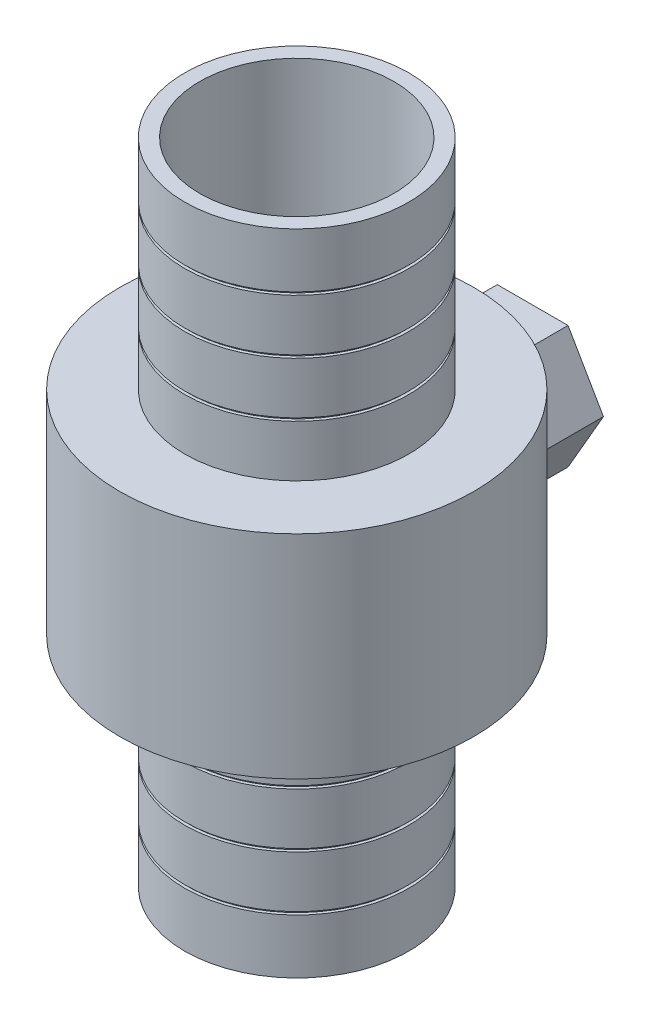
ISO-10303-21;
HEADER;
FILE_DESCRIPTION(('STEP AP214'),'2;1');
FILE_NAME('part.step','',(''),(''),'','','');
FILE_SCHEMA(('AUTOMOTIVE_DESIGN { 1 0 10303 214 1 1 1 1 }'));
ENDSEC;
DATA;
#1=APPLICATION_CONTEXT('core data for automotive mechanical design processes');
#2=APPLICATION_PROTOCOL_DEFINITION('international standard','automotive_design',2000,#1);
#3=PRODUCT_CONTEXT('',#1,'mechanical');
#4=PRODUCT('Part','Part','',(#3));
#5=PRODUCT_RELATED_PRODUCT_CATEGORY('part','',(#4));
#6=PRODUCT_DEFINITION_FORMATION('','',#4);
#7=PRODUCT_DEFINITION_CONTEXT('part definition',#1,'design');
#8=PRODUCT_DEFINITION('design','',#6,#7);
#9=PRODUCT_DEFINITION_SHAPE('','',#8);
#10=(LENGTH_UNIT() NAMED_UNIT(*) SI_UNIT(.MILLI.,.METRE.));
#11=(NAMED_UNIT(*) PLANE_ANGLE_UNIT() SI_UNIT($,.RADIAN.));
#12=(NAMED_UNIT(*) SI_UNIT($,.STERADIAN.) SOLID_ANGLE_UNIT());
#13=UNCERTAINTY_MEASURE_WITH_UNIT(LENGTH_MEASURE(1.E-05),#10,'distance_accuracy_value','');
#14=(GEOMETRIC_REPRESENTATION_CONTEXT(3) GLOBAL_UNCERTAINTY_ASSIGNED_CONTEXT((#13)) GLOBAL_UNIT_ASSIGNED_CONTEXT((#10,
#11,#12)) REPRESENTATION_CONTEXT('',''));
#15=CARTESIAN_POINT('',(0.,0.,0.));
#16=DIRECTION('',(0.,0.,1.));
#17=DIRECTION('',(1.,0.,0.));
#18=AXIS2_PLACEMENT_3D('',#15,#16,#17);
#19=CARTESIAN_POINT('',(6.,27.5,-20.));
#20=DIRECTION('',(-0.866025403784439,0.5,0.));
#21=DIRECTION('',(-0.5,-0.866025403784439,0.));
#22=AXIS2_PLACEMENT_3D('',#19,#20,#21);
#23=PLANE('',#22);
#24=DIRECTION('',(-0.5,-0.866025403784439,0.));
#25=VECTOR('',#24,1.);
#26=CARTESIAN_POINT('',(6.,27.5,-15.));
#27=LINE('',#26,#25);
#28=CARTESIAN_POINT('',(6.,27.5,-15.));
#29=VERTEX_POINT('',#28);
#30=CARTESIAN_POINT('',(3.,22.3038475772934,-15.));
#31=VERTEX_POINT('',#30);
#32=EDGE_CURVE('E173',#29,#31,#27,.T.);
#33=ORIENTED_EDGE('',*,*,#32,.T.);
#34=DIRECTION('',(0.,0.,1.));
#35=VECTOR('',#34,1.);
#36=CARTESIAN_POINT('',(3.,22.3038475772934,-20.));
#37=LINE('',#36,#35);
#38=CARTESIAN_POINT('',(3.,22.3038475772934,-20.));
#39=VERTEX_POINT('',#38);
#40=EDGE_CURVE('E13',#39,#31,#37,.T.);
#41=ORIENTED_EDGE('',*,*,#40,.F.);
#42=DIRECTION('',(-0.5,-0.866025403784439,0.));
#43=VECTOR('',#42,1.);
#44=CARTESIAN_POINT('',(6.,27.5,-20.));
#45=LINE('',#44,#43);
#46=CARTESIAN_POINT('',(6.,27.5,-20.));
#47=VERTEX_POINT('',#46);
#48=EDGE_CURVE('E183',#47,#39,#45,.T.);
#49=ORIENTED_EDGE('',*,*,#48,.F.);
#50=DIRECTION('',(0.,0.,1.));
#51=VECTOR('',#50,1.);
#52=CARTESIAN_POINT('',(6.,27.5,-20.));
#53=LINE('',#52,#51);
#54=EDGE_CURVE('E169',#47,#29,#53,.T.);
#55=ORIENTED_EDGE('',*,*,#54,.T.);
#56=EDGE_LOOP('',(#33,#41,#49,#55));
#57=FACE_BOUND('',#56,.T.);
#58=ADVANCED_FACE('F89',(#57),#23,.F.);
#59=CARTESIAN_POINT('',(3.,22.3038475772934,-20.));
#60=DIRECTION('',(0.,1.,0.));
#61=DIRECTION('',(0.,0.,1.));
#62=AXIS2_PLACEMENT_3D('',#59,#60,#61);
#63=PLANE('',#62);
#64=DIRECTION('',(-1.,0.,0.));
#65=VECTOR('',#64,1.);
#66=CARTESIAN_POINT('',(3.,22.3038475772934,-15.));
#67=LINE('',#66,#65);
#68=CARTESIAN_POINT('',(-3.,22.3038475772934,-15.));
#69=VERTEX_POINT('',#68);
#70=EDGE_CURVE('E176',#31,#69,#67,.T.);
#71=ORIENTED_EDGE('',*,*,#70,.T.);
#72=DIRECTION('',(0.,0.,1.));
#73=VECTOR('',#72,1.);
#74=CARTESIAN_POINT('',(-3.,22.3038475772934,-20.));
#75=LINE('',#74,#73);
#76=CARTESIAN_POINT('',(-3.,22.3038475772934,-20.));
#77=VERTEX_POINT('',#76);
#78=EDGE_CURVE('E97',#77,#69,#75,.T.);
#79=ORIENTED_EDGE('',*,*,#78,.F.);
#80=DIRECTION('',(-1.,0.,0.));
#81=VECTOR('',#80,1.);
#82=CARTESIAN_POINT('',(3.,22.3038475772934,-20.));
#83=LINE('',#82,#81);
#84=EDGE_CURVE('E142',#39,#77,#83,.T.);
#85=ORIENTED_EDGE('',*,*,#84,.F.);
#86=ORIENTED_EDGE('',*,*,#40,.T.);
#87=EDGE_LOOP('',(#71,#79,#85,#86));
#88=FACE_BOUND('',#87,.T.);
#89=ADVANCED_FACE('F207',(#88),#63,.F.);
#90=CARTESIAN_POINT('',(-3.,22.3038475772934,-20.));
#91=DIRECTION('',(0.866025403784439,0.5,0.));
#92=DIRECTION('',(-0.5,0.866025403784439,0.));
#93=AXIS2_PLACEMENT_3D('',#90,#91,#92);
#94=PLANE('',#93);
#95=DIRECTION('',(-0.5,0.866025403784439,0.));
#96=VECTOR('',#95,1.);
#97=CARTESIAN_POINT('',(-3.,22.3038475772934,-15.));
#98=LINE('',#97,#96);
#99=CARTESIAN_POINT('',(-6.,27.5,-15.));
#100=VERTEX_POINT('',#99);
#101=EDGE_CURVE('E178',#69,#100,#98,.T.);
#102=ORIENTED_EDGE('',*,*,#101,.T.);
#103=DIRECTION('',(0.,0.,1.));
#104=VECTOR('',#103,1.);
#105=CARTESIAN_POINT('',(-6.,27.5,-20.));
#106=LINE('',#105,#104);
#107=CARTESIAN_POINT('',(-6.,27.5,-20.));
#108=VERTEX_POINT('',#107);
#109=EDGE_CURVE('E164',#108,#100,#106,.T.);
#110=ORIENTED_EDGE('',*,*,#109,.F.);
#111=DIRECTION('',(-0.5,0.866025403784439,0.));
#112=VECTOR('',#111,1.);
#113=CARTESIAN_POINT('',(-3.,22.3038475772934,-20.));
#114=LINE('',#113,#112);
#115=EDGE_CURVE('E155',#77,#108,#114,.T.);
#116=ORIENTED_EDGE('',*,*,#115,.F.);
#117=ORIENTED_EDGE('',*,*,#78,.T.);
#118=EDGE_LOOP('',(#102,#110,#116,#117));
#119=FACE_BOUND('',#118,.T.);
#120=ADVANCED_FACE('F189',(#119),#94,.F.);
#121=CARTESIAN_POINT('',(-6.,27.5,-20.));
#122=DIRECTION('',(0.866025403784439,-0.5,0.));
#123=DIRECTION('',(0.5,0.866025403784439,0.));
#124=AXIS2_PLACEMENT_3D('',#121,#122,#123);
#125=PLANE('',#124);
#126=DIRECTION('',(0.5,0.866025403784439,0.));
#127=VECTOR('',#126,1.);
#128=CARTESIAN_POINT('',(-6.,27.5,-15.));
#129=LINE('',#128,#127);
#130=CARTESIAN_POINT('',(-3.00000000000001,32.6961524227066,-15.));
#131=VERTEX_POINT('',#130);
#132=EDGE_CURVE('E163',#100,#131,#129,.T.);
#133=ORIENTED_EDGE('',*,*,#132,.T.);
#134=DIRECTION('',(0.,0.,1.));
#135=VECTOR('',#134,1.);
#136=CARTESIAN_POINT('',(-3.00000000000001,32.6961524227066,-20.));
#137=LINE('',#136,#135);
#138=CARTESIAN_POINT('',(-3.00000000000001,32.6961524227066,-20.));
#139=VERTEX_POINT('',#138);
#140=EDGE_CURVE('E160',#139,#131,#137,.T.);
#141=ORIENTED_EDGE('',*,*,#140,.F.);
#142=DIRECTION('',(0.5,0.866025403784439,0.));
#143=VECTOR('',#142,1.);
#144=CARTESIAN_POINT('',(-6.,27.5,-20.));
#145=LINE('',#144,#143);
#146=EDGE_CURVE('E149',#108,#139,#145,.T.);
#147=ORIENTED_EDGE('',*,*,#146,.F.);
#148=ORIENTED_EDGE('',*,*,#109,.T.);
#149=EDGE_LOOP('',(#133,#141,#147,#148));
#150=FACE_BOUND('',#149,.T.);
#151=ADVANCED_FACE('F161',(#150),#125,.F.);
#152=CARTESIAN_POINT('',(-3.00000000000001,32.6961524227066,-20.));
#153=DIRECTION('',(0.,-1.,0.));
#154=DIRECTION('',(0.,0.,-1.));
#155=AXIS2_PLACEMENT_3D('',#152,#153,#154);
#156=PLANE('',#155);
#157=DIRECTION('',(1.,0.,0.));
#158=VECTOR('',#157,1.);
#159=CARTESIAN_POINT('',(-3.00000000000001,32.6961524227066,-15.));
#160=LINE('',#159,#158);
#161=CARTESIAN_POINT('',(3.,32.6961524227066,-15.));
#162=VERTEX_POINT('',#161);
#163=EDGE_CURVE('E128',#131,#162,#160,.T.);
#164=ORIENTED_EDGE('',*,*,#163,.T.);
#165=DIRECTION('',(0.,0.,1.));
#166=VECTOR('',#165,1.);
#167=CARTESIAN_POINT('',(3.,32.6961524227066,-20.));
#168=LINE('',#167,#166);
#169=CARTESIAN_POINT('',(3.,32.6961524227066,-20.));
#170=VERTEX_POINT('',#169);
#171=EDGE_CURVE('E165',#170,#162,#168,.T.);
#172=ORIENTED_EDGE('',*,*,#171,.F.);
#173=DIRECTION('',(1.,0.,0.));
#174=VECTOR('',#173,1.);
#175=CARTESIAN_POINT('',(-3.00000000000001,32.6961524227066,-20.));
#176=LINE('',#175,#174);
#177=EDGE_CURVE('E153',#139,#170,#176,.T.);
#178=ORIENTED_EDGE('',*,*,#177,.F.);
#179=ORIENTED_EDGE('',*,*,#140,.T.);
#180=EDGE_LOOP('',(#164,#172,#178,#179));
#181=FACE_BOUND('',#180,.T.);
#182=ADVANCED_FACE('F167',(#181),#156,.F.);
#183=CARTESIAN_POINT('',(3.,32.6961524227066,-20.));
#184=DIRECTION('',(-0.866025403784439,-0.5,0.));
#185=DIRECTION('',(0.5,-0.866025403784439,0.));
#186=AXIS2_PLACEMENT_3D('',#183,#184,#185);
#187=PLANE('',#186);
#188=DIRECTION('',(0.5,-0.866025403784439,0.));
#189=VECTOR('',#188,1.);
#190=CARTESIAN_POINT('',(3.,32.6961524227066,-15.));
#191=LINE('',#190,#189);
#192=EDGE_CURVE('E134',#162,#29,#191,.T.);
#193=ORIENTED_EDGE('',*,*,#192,.T.);
#194=ORIENTED_EDGE('',*,*,#54,.F.);
#195=DIRECTION('',(0.5,-0.866025403784439,0.));
#196=VECTOR('',#195,1.);
#197=CARTESIAN_POINT('',(3.,32.6961524227066,-20.));
#198=LINE('',#197,#196);
#199=EDGE_CURVE('E105',#170,#47,#198,.T.);
#200=ORIENTED_EDGE('',*,*,#199,.F.);
#201=ORIENTED_EDGE('',*,*,#171,.T.);
#202=EDGE_LOOP('',(#193,#194,#200,#201));
#203=FACE_BOUND('',#202,.T.);
#204=ADVANCED_FACE('F196',(#203),#187,.F.);
#205=CARTESIAN_POINT('',(0.,0.,-20.));
#206=DIRECTION('',(0.,0.,-1.));
#207=DIRECTION('',(-1.,0.,0.));
#208=AXIS2_PLACEMENT_3D('',#205,#206,#207);
#209=PLANE('',#208);
#210=ORIENTED_EDGE('',*,*,#48,.T.);
#211=ORIENTED_EDGE('',*,*,#84,.T.);
#212=ORIENTED_EDGE('',*,*,#115,.T.);
#213=ORIENTED_EDGE('',*,*,#146,.T.);
#214=ORIENTED_EDGE('',*,*,#177,.T.);
#215=ORIENTED_EDGE('',*,*,#199,.T.);
#216=EDGE_LOOP('',(#210,#211,#212,#213,#214,#215));
#217=FACE_BOUND('',#216,.T.);
#218=ADVANCED_FACE('F151',(#217),#209,.T.);
#219=CARTESIAN_POINT('',(0.,0.,-15.));
#220=DIRECTION('',(0.,0.,-1.));
#221=DIRECTION('',(-1.,0.,0.));
#222=AXIS2_PLACEMENT_3D('',#219,#220,#221);
#223=PLANE('',#222);
#224=ORIENTED_EDGE('',*,*,#32,.F.);
#225=ORIENTED_EDGE('',*,*,#192,.F.);
#226=ORIENTED_EDGE('',*,*,#163,.F.);
#227=ORIENTED_EDGE('',*,*,#132,.F.);
#228=ORIENTED_EDGE('',*,*,#101,.F.);
#229=ORIENTED_EDGE('',*,*,#70,.F.);
#230=EDGE_LOOP('',(#224,#225,#226,#227,#228,#229));
#231=FACE_BOUND('',#230,.T.);
#232=ADVANCED_FACE('F192',(#231),#223,.F.);
#233=CLOSED_SHELL('',(#58,#89,#120,#151,#182,#204,#218,#232));
#234=MANIFOLD_SOLID_BREP('B2',#233);
#235=CARTESIAN_POINT('',(0.,55.,0.));
#236=DIRECTION('',(0.,-1.,0.));
#237=DIRECTION('',(0.,0.,-1.));
#238=AXIS2_PLACEMENT_3D('',#235,#236,#237);
#239=CYLINDRICAL_SURFACE('',#238,9.5);
#240=CARTESIAN_POINT('',(0.,36.5,0.));
#241=DIRECTION('',(0.,1.,0.));
#242=DIRECTION('',(0.,0.,1.));
#243=AXIS2_PLACEMENT_3D('',#240,#241,#242);
#244=CIRCLE('',#243,9.5);
#245=CARTESIAN_POINT('',(0.,36.5,9.5));
#246=VERTEX_POINT('',#245);
#247=EDGE_CURVE('E88',#246,#246,#244,.T.);
#248=ORIENTED_EDGE('',*,*,#247,.T.);
#249=EDGE_LOOP('',(#248));
#250=FACE_BOUND('',#249,.T.);
#251=CARTESIAN_POINT('',(0.,40.875,0.));
#252=DIRECTION('',(0.,-1.,0.));
#253=DIRECTION('',(0.,0.,-1.));
#254=AXIS2_PLACEMENT_3D('',#251,#252,#253);
#255=CIRCLE('',#254,9.5);
#256=CARTESIAN_POINT('',(0.,40.875,-9.5));
#257=VERTEX_POINT('',#256);
#258=EDGE_CURVE('E352',#257,#257,#255,.T.);
#259=ORIENTED_EDGE('',*,*,#258,.T.);
#260=EDGE_LOOP('',(#259));
#261=FACE_BOUND('',#260,.T.);
#262=ADVANCED_FACE('F265',(#250,#261),#239,.T.);
#263=CARTESIAN_POINT('',(0.,18.5,0.));
#264=DIRECTION('',(0.,-1.,0.));
#265=DIRECTION('',(0.,0.,-1.));
#266=AXIS2_PLACEMENT_3D('',#263,#264,#265);
#267=CYLINDRICAL_SURFACE('',#266,9.5);
#268=CARTESIAN_POINT('',(0.,9.25,0.));
#269=DIRECTION('',(0.,-1.,0.));
#270=DIRECTION('',(0.,0.,-1.));
#271=AXIS2_PLACEMENT_3D('',#268,#269,#270);
#272=CIRCLE('',#271,9.5);
#273=CARTESIAN_POINT('',(0.,9.25,-9.5));
#274=VERTEX_POINT('',#273);
#275=EDGE_CURVE('E334',#274,#274,#272,.T.);
#276=ORIENTED_EDGE('',*,*,#275,.T.);
#277=EDGE_LOOP('',(#276));
#278=FACE_BOUND('',#277,.T.);
#279=CARTESIAN_POINT('',(0.,4.875,0.));
#280=DIRECTION('',(0.,-1.,0.));
#281=DIRECTION('',(0.,0.,-1.));
#282=AXIS2_PLACEMENT_3D('',#279,#280,#281);
#283=CIRCLE('',#282,9.5);
#284=CARTESIAN_POINT('',(0.,4.875,-9.5));
#285=VERTEX_POINT('',#284);
#286=EDGE_CURVE('E295',#285,#285,#283,.T.);
#287=ORIENTED_EDGE('',*,*,#286,.F.);
#288=EDGE_LOOP('',(#287));
#289=FACE_BOUND('',#288,.T.);
#290=ADVANCED_FACE('F431',(#278,#289),#267,.T.);
#291=CARTESIAN_POINT('',(0.,4.875,0.));
#292=DIRECTION('',(0.,-1.,0.));
#293=DIRECTION('',(0.,0.,-1.));
#294=AXIS2_PLACEMENT_3D('',#291,#292,#293);
#295=PLANE('',#294);
#296=CARTESIAN_POINT('',(0.,4.875,0.));
#297=DIRECTION('',(0.,-1.,0.));
#298=DIRECTION('',(0.,0.,-1.));
#299=AXIS2_PLACEMENT_3D('',#296,#297,#298);
#300=CIRCLE('',#299,9.25);
#301=CARTESIAN_POINT('',(0.,4.875,-9.25));
#302=VERTEX_POINT('',#301);
#303=EDGE_CURVE('E306',#302,#302,#300,.T.);
#304=ORIENTED_EDGE('',*,*,#303,.F.);
#305=EDGE_LOOP('',(#304));
#306=FACE_BOUND('',#305,.T.);
#307=ORIENTED_EDGE('',*,*,#286,.T.);
#308=EDGE_LOOP('',(#307));
#309=FACE_BOUND('',#308,.T.);
#310=ADVANCED_FACE('F438',(#306,#309),#295,.T.);
#311=CARTESIAN_POINT('',(0.,4.625,0.));
#312=DIRECTION('',(0.,-1.,0.));
#313=DIRECTION('',(0.,0.,-1.));
#314=AXIS2_PLACEMENT_3D('',#311,#312,#313);
#315=PLANE('',#314);
#316=CARTESIAN_POINT('',(0.,4.625,0.));
#317=DIRECTION('',(0.,-1.,0.));
#318=DIRECTION('',(0.,0.,-1.));
#319=AXIS2_PLACEMENT_3D('',#316,#317,#318);
#320=CIRCLE('',#319,9.25);
#321=CARTESIAN_POINT('',(0.,4.625,-9.25));
#322=VERTEX_POINT('',#321);
#323=EDGE_CURVE('E308',#322,#322,#320,.T.);
#324=ORIENTED_EDGE('',*,*,#323,.T.);
#325=EDGE_LOOP('',(#324));
#326=FACE_BOUND('',#325,.T.);
#327=CARTESIAN_POINT('',(0.,4.625,0.));
#328=DIRECTION('',(0.,-1.,0.));
#329=DIRECTION('',(0.,0.,-1.));
#330=AXIS2_PLACEMENT_3D('',#327,#328,#329);
#331=CIRCLE('',#330,9.5);
#332=CARTESIAN_POINT('',(0.,4.625,-9.5));
#333=VERTEX_POINT('',#332);
#334=EDGE_CURVE('E300',#333,#333,#331,.T.);
#335=ORIENTED_EDGE('',*,*,#334,.F.);
#336=EDGE_LOOP('',(#335));
#337=FACE_BOUND('',#336,.T.);
#338=ADVANCED_FACE('F523',(#326,#337),#315,.F.);
#339=CARTESIAN_POINT('',(0.,4.875,0.));
#340=DIRECTION('',(0.,-1.,0.));
#341=DIRECTION('',(0.,0.,-1.));
#342=AXIS2_PLACEMENT_3D('',#339,#340,#341);
#343=CYLINDRICAL_SURFACE('',#342,9.25);
#344=ORIENTED_EDGE('',*,*,#303,.T.);
#345=EDGE_LOOP('',(#344));
#346=FACE_BOUND('',#345,.T.);
#347=ORIENTED_EDGE('',*,*,#323,.F.);
#348=EDGE_LOOP('',(#347));
#349=FACE_BOUND('',#348,.T.);
#350=ADVANCED_FACE('F520',(#346,#349),#343,.T.);
#351=CARTESIAN_POINT('',(0.,0.,0.));
#352=DIRECTION('',(0.,1.,0.));
#353=DIRECTION('',(0.,0.,1.));
#354=AXIS2_PLACEMENT_3D('',#351,#352,#353);
#355=PLANE('',#354);
#356=CARTESIAN_POINT('',(0.,0.,0.));
#357=DIRECTION('',(0.,1.,0.));
#358=DIRECTION('',(0.,0.,1.));
#359=AXIS2_PLACEMENT_3D('',#356,#357,#358);
#360=CIRCLE('',#359,8.23);
#361=CARTESIAN_POINT('',(0.,0.,8.23));
#362=VERTEX_POINT('',#361);
#363=EDGE_CURVE('E362',#362,#362,#360,.T.);
#364=ORIENTED_EDGE('',*,*,#363,.T.);
#365=EDGE_LOOP('',(#364));
#366=FACE_BOUND('',#365,.T.);
#367=CARTESIAN_POINT('',(0.,0.,0.));
#368=DIRECTION('',(0.,1.,0.));
#369=DIRECTION('',(0.,0.,1.));
#370=AXIS2_PLACEMENT_3D('',#367,#368,#369);
#371=CIRCLE('',#370,9.5);
#372=CARTESIAN_POINT('',(0.,0.,9.5));
#373=VERTEX_POINT('',#372);
#374=EDGE_CURVE('E269',#373,#373,#371,.T.);
#375=ORIENTED_EDGE('',*,*,#374,.F.);
#376=EDGE_LOOP('',(#375));
#377=FACE_BOUND('',#376,.T.);
#378=ADVANCED_FACE('F404',(#366,#377),#355,.F.);
#379=ORIENTED_EDGE('',*,*,#334,.T.);
#380=EDGE_LOOP('',(#379));
#381=FACE_BOUND('',#380,.T.);
#382=ORIENTED_EDGE('',*,*,#374,.T.);
#383=EDGE_LOOP('',(#382));
#384=FACE_BOUND('',#383,.T.);
#385=ADVANCED_FACE('F267',(#381,#384),#267,.T.);
#386=CARTESIAN_POINT('',(0.,9.5,0.));
#387=DIRECTION('',(0.,-1.,0.));
#388=DIRECTION('',(0.,0.,-1.));
#389=AXIS2_PLACEMENT_3D('',#386,#387,#388);
#390=PLANE('',#389);
#391=CARTESIAN_POINT('',(0.,9.5,0.));
#392=DIRECTION('',(0.,-1.,0.));
#393=DIRECTION('',(0.,0.,-1.));
#394=AXIS2_PLACEMENT_3D('',#391,#392,#393);
#395=CIRCLE('',#394,9.25);
#396=CARTESIAN_POINT('',(0.,9.5,-9.25));
#397=VERTEX_POINT('',#396);
#398=EDGE_CURVE('E338',#397,#397,#395,.T.);
#399=ORIENTED_EDGE('',*,*,#398,.F.);
#400=EDGE_LOOP('',(#399));
#401=FACE_BOUND('',#400,.T.);
#402=CARTESIAN_POINT('',(0.,9.5,0.));
#403=DIRECTION('',(0.,-1.,0.));
#404=DIRECTION('',(0.,0.,-1.));
#405=AXIS2_PLACEMENT_3D('',#402,#403,#404);
#406=CIRCLE('',#405,9.5);
#407=CARTESIAN_POINT('',(0.,9.5,-9.5));
#408=VERTEX_POINT('',#407);
#409=EDGE_CURVE('E312',#408,#408,#406,.T.);
#410=ORIENTED_EDGE('',*,*,#409,.T.);
#411=EDGE_LOOP('',(#410));
#412=FACE_BOUND('',#411,.T.);
#413=ADVANCED_FACE('F500',(#401,#412),#390,.T.);
#414=CARTESIAN_POINT('',(0.,9.25,0.));
#415=DIRECTION('',(0.,-1.,0.));
#416=DIRECTION('',(0.,0.,-1.));
#417=AXIS2_PLACEMENT_3D('',#414,#415,#416);
#418=PLANE('',#417);
#419=CARTESIAN_POINT('',(0.,9.25,0.));
#420=DIRECTION('',(0.,-1.,0.));
#421=DIRECTION('',(0.,0.,-1.));
#422=AXIS2_PLACEMENT_3D('',#419,#420,#421);
#423=CIRCLE('',#422,9.25);
#424=CARTESIAN_POINT('',(0.,9.25,-9.25));
#425=VERTEX_POINT('',#424);
#426=EDGE_CURVE('E325',#425,#425,#423,.T.);
#427=ORIENTED_EDGE('',*,*,#426,.T.);
#428=EDGE_LOOP('',(#427));
#429=FACE_BOUND('',#428,.T.);
#430=ORIENTED_EDGE('',*,*,#275,.F.);
#431=EDGE_LOOP('',(#430));
#432=FACE_BOUND('',#431,.T.);
#433=ADVANCED_FACE('F498',(#429,#432),#418,.F.);
#434=CARTESIAN_POINT('',(0.,9.5,0.));
#435=DIRECTION('',(0.,-1.,0.));
#436=DIRECTION('',(0.,0.,-1.));
#437=AXIS2_PLACEMENT_3D('',#434,#435,#436);
#438=CYLINDRICAL_SURFACE('',#437,9.25);
#439=ORIENTED_EDGE('',*,*,#398,.T.);
#440=EDGE_LOOP('',(#439));
#441=FACE_BOUND('',#440,.T.);
#442=ORIENTED_EDGE('',*,*,#426,.F.);
#443=EDGE_LOOP('',(#442));
#444=FACE_BOUND('',#443,.T.);
#445=ADVANCED_FACE('F494',(#441,#444),#438,.T.);
#446=CARTESIAN_POINT('',(0.,13.875,0.));
#447=DIRECTION('',(0.,-1.,0.));
#448=DIRECTION('',(0.,0.,-1.));
#449=AXIS2_PLACEMENT_3D('',#446,#447,#448);
#450=CIRCLE('',#449,9.5);
#451=CARTESIAN_POINT('',(0.,13.875,-9.5));
#452=VERTEX_POINT('',#451);
#453=EDGE_CURVE('E316',#452,#452,#450,.T.);
#454=ORIENTED_EDGE('',*,*,#453,.T.);
#455=EDGE_LOOP('',(#454));
#456=FACE_BOUND('',#455,.T.);
#457=ORIENTED_EDGE('',*,*,#409,.F.);
#458=EDGE_LOOP('',(#457));
#459=FACE_BOUND('',#458,.T.);
#460=ADVANCED_FACE('F497',(#456,#459),#267,.T.);
#461=CARTESIAN_POINT('',(0.,14.125,0.));
#462=DIRECTION('',(0.,-1.,0.));
#463=DIRECTION('',(0.,0.,-1.));
#464=AXIS2_PLACEMENT_3D('',#461,#462,#463);
#465=PLANE('',#464);
#466=CARTESIAN_POINT('',(0.,14.125,0.));
#467=DIRECTION('',(0.,-1.,0.));
#468=DIRECTION('',(0.,0.,-1.));
#469=AXIS2_PLACEMENT_3D('',#466,#467,#468);
#470=CIRCLE('',#469,9.25);
#471=CARTESIAN_POINT('',(0.,14.125,-9.25));
#472=VERTEX_POINT('',#471);
#473=EDGE_CURVE('E321',#472,#472,#470,.T.);
#474=ORIENTED_EDGE('',*,*,#473,.F.);
#475=EDGE_LOOP('',(#474));
#476=FACE_BOUND('',#475,.T.);
#477=CARTESIAN_POINT('',(0.,14.125,0.));
#478=DIRECTION('',(0.,-1.,0.));
#479=DIRECTION('',(0.,0.,-1.));
#480=AXIS2_PLACEMENT_3D('',#477,#478,#479);
#481=CIRCLE('',#480,9.5);
#482=CARTESIAN_POINT('',(0.,14.125,-9.5));
#483=VERTEX_POINT('',#482);
#484=EDGE_CURVE('E320',#483,#483,#481,.T.);
#485=ORIENTED_EDGE('',*,*,#484,.T.);
#486=EDGE_LOOP('',(#485));
#487=FACE_BOUND('',#486,.T.);
#488=ADVANCED_FACE('F513',(#476,#487),#465,.T.);
#489=CARTESIAN_POINT('',(0.,13.875,0.));
#490=DIRECTION('',(0.,-1.,0.));
#491=DIRECTION('',(0.,0.,-1.));
#492=AXIS2_PLACEMENT_3D('',#489,#490,#491);
#493=PLANE('',#492);
#494=CARTESIAN_POINT('',(0.,13.875,0.));
#495=DIRECTION('',(0.,-1.,0.));
#496=DIRECTION('',(0.,0.,-1.));
#497=AXIS2_PLACEMENT_3D('',#494,#495,#496);
#498=CIRCLE('',#497,9.25);
#499=CARTESIAN_POINT('',(0.,13.875,-9.25));
#500=VERTEX_POINT('',#499);
#501=EDGE_CURVE('E326',#500,#500,#498,.T.);
#502=ORIENTED_EDGE('',*,*,#501,.T.);
#503=EDGE_LOOP('',(#502));
#504=FACE_BOUND('',#503,.T.);
#505=ORIENTED_EDGE('',*,*,#453,.F.);
#506=EDGE_LOOP('',(#505));
#507=FACE_BOUND('',#506,.T.);
#508=ADVANCED_FACE('F511',(#504,#507),#493,.F.);
#509=CARTESIAN_POINT('',(0.,14.125,0.));
#510=DIRECTION('',(0.,-1.,0.));
#511=DIRECTION('',(0.,0.,-1.));
#512=AXIS2_PLACEMENT_3D('',#509,#510,#511);
#513=CYLINDRICAL_SURFACE('',#512,9.25);
#514=ORIENTED_EDGE('',*,*,#473,.T.);
#515=EDGE_LOOP('',(#514));
#516=FACE_BOUND('',#515,.T.);
#517=ORIENTED_EDGE('',*,*,#501,.F.);
#518=EDGE_LOOP('',(#517));
#519=FACE_BOUND('',#518,.T.);
#520=ADVANCED_FACE('F507',(#516,#519),#513,.T.);
#521=CARTESIAN_POINT('',(0.,36.5,0.));
#522=DIRECTION('',(0.,1.,0.));
#523=DIRECTION('',(0.,0.,1.));
#524=AXIS2_PLACEMENT_3D('',#521,#522,#523);
#525=PLANE('',#524);
#526=ORIENTED_EDGE('',*,*,#247,.F.);
#527=EDGE_LOOP('',(#526));
#528=FACE_BOUND('',#527,.T.);
#529=CARTESIAN_POINT('',(0.,36.5,0.));
#530=DIRECTION('',(0.,1.,0.));
#531=DIRECTION('',(0.,0.,1.));
#532=AXIS2_PLACEMENT_3D('',#529,#530,#531);
#533=CIRCLE('',#532,15.);
#534=CARTESIAN_POINT('',(0.,36.5,15.));
#535=VERTEX_POINT('',#534);
#536=EDGE_CURVE('E284',#535,#535,#533,.T.);
#537=ORIENTED_EDGE('',*,*,#536,.T.);
#538=EDGE_LOOP('',(#537));
#539=FACE_BOUND('',#538,.T.);
#540=ADVANCED_FACE('F510',(#528,#539),#525,.T.);
#541=CARTESIAN_POINT('',(0.,36.5,0.));
#542=DIRECTION('',(0.,-1.,0.));
#543=DIRECTION('',(0.,0.,-1.));
#544=AXIS2_PLACEMENT_3D('',#541,#542,#543);
#545=CYLINDRICAL_SURFACE('',#544,15.);
#546=ORIENTED_EDGE('',*,*,#536,.F.);
#547=EDGE_LOOP('',(#546));
#548=FACE_BOUND('',#547,.T.);
#549=CARTESIAN_POINT('',(0.,18.5,0.));
#550=DIRECTION('',(0.,1.,0.));
#551=DIRECTION('',(0.,0.,1.));
#552=AXIS2_PLACEMENT_3D('',#549,#550,#551);
#553=CIRCLE('',#552,15.);
#554=CARTESIAN_POINT('',(0.,18.5,15.));
#555=VERTEX_POINT('',#554);
#556=EDGE_CURVE('E288',#555,#555,#553,.T.);
#557=ORIENTED_EDGE('',*,*,#556,.T.);
#558=EDGE_LOOP('',(#557));
#559=FACE_BOUND('',#558,.T.);
#560=ADVANCED_FACE('F544',(#548,#559),#545,.T.);
#561=CARTESIAN_POINT('',(0.,18.5,0.));
#562=DIRECTION('',(0.,1.,0.));
#563=DIRECTION('',(0.,0.,1.));
#564=AXIS2_PLACEMENT_3D('',#561,#562,#563);
#565=PLANE('',#564);
#566=CARTESIAN_POINT('',(0.,18.5,0.));
#567=DIRECTION('',(0.,1.,0.));
#568=DIRECTION('',(0.,0.,1.));
#569=AXIS2_PLACEMENT_3D('',#566,#567,#568);
#570=CIRCLE('',#569,9.5);
#571=CARTESIAN_POINT('',(0.,18.5,9.5));
#572=VERTEX_POINT('',#571);
#573=EDGE_CURVE('E274',#572,#572,#570,.T.);
#574=ORIENTED_EDGE('',*,*,#573,.T.);
#575=EDGE_LOOP('',(#574));
#576=FACE_BOUND('',#575,.T.);
#577=ORIENTED_EDGE('',*,*,#556,.F.);
#578=EDGE_LOOP('',(#577));
#579=FACE_BOUND('',#578,.T.);
#580=ADVANCED_FACE('F546',(#576,#579),#565,.F.);
#581=ORIENTED_EDGE('',*,*,#573,.F.);
#582=EDGE_LOOP('',(#581));
#583=FACE_BOUND('',#582,.T.);
#584=ORIENTED_EDGE('',*,*,#484,.F.);
#585=EDGE_LOOP('',(#584));
#586=FACE_BOUND('',#585,.T.);
#587=ADVANCED_FACE('F440',(#583,#586),#267,.T.);
#588=CARTESIAN_POINT('',(0.,40.875,0.));
#589=DIRECTION('',(0.,1.,0.));
#590=DIRECTION('',(0.,0.,-1.));
#591=AXIS2_PLACEMENT_3D('',#588,#589,#590);
#592=PLANE('',#591);
#593=ORIENTED_EDGE('',*,*,#258,.F.);
#594=EDGE_LOOP('',(#593));
#595=FACE_BOUND('',#594,.T.);
#596=CARTESIAN_POINT('',(0.,40.875,0.));
#597=DIRECTION('',(0.,-1.,0.));
#598=DIRECTION('',(0.,0.,-1.));
#599=AXIS2_PLACEMENT_3D('',#596,#597,#598);
#600=CIRCLE('',#599,9.25);
#601=CARTESIAN_POINT('',(0.,40.875,-9.25));
#602=VERTEX_POINT('',#601);
#603=EDGE_CURVE('E353',#602,#602,#600,.T.);
#604=ORIENTED_EDGE('',*,*,#603,.T.);
#605=EDGE_LOOP('',(#604));
#606=FACE_BOUND('',#605,.T.);
#607=ADVANCED_FACE('F488',(#595,#606),#592,.T.);
#608=CARTESIAN_POINT('',(0.,41.125,0.));
#609=DIRECTION('',(0.,1.,0.));
#610=DIRECTION('',(0.,0.,-1.));
#611=AXIS2_PLACEMENT_3D('',#608,#609,#610);
#612=PLANE('',#611);
#613=CARTESIAN_POINT('',(0.,41.125,0.));
#614=DIRECTION('',(0.,-1.,0.));
#615=DIRECTION('',(0.,0.,-1.));
#616=AXIS2_PLACEMENT_3D('',#613,#614,#615);
#617=CIRCLE('',#616,9.5);
#618=CARTESIAN_POINT('',(0.,41.125,-9.5));
#619=VERTEX_POINT('',#618);
#620=EDGE_CURVE('E348',#619,#619,#617,.T.);
#621=ORIENTED_EDGE('',*,*,#620,.T.);
#622=EDGE_LOOP('',(#621));
#623=FACE_BOUND('',#622,.T.);
#624=CARTESIAN_POINT('',(0.,41.125,0.));
#625=DIRECTION('',(0.,-1.,0.));
#626=DIRECTION('',(0.,0.,-1.));
#627=AXIS2_PLACEMENT_3D('',#624,#625,#626);
#628=CIRCLE('',#627,9.25);
#629=CARTESIAN_POINT('',(0.,41.125,-9.25));
#630=VERTEX_POINT('',#629);
#631=EDGE_CURVE('E358',#630,#630,#628,.T.);
#632=ORIENTED_EDGE('',*,*,#631,.F.);
#633=EDGE_LOOP('',(#632));
#634=FACE_BOUND('',#633,.T.);
#635=ADVANCED_FACE('F454',(#623,#634),#612,.F.);
#636=CARTESIAN_POINT('',(0.,40.875,0.));
#637=DIRECTION('',(0.,1.,0.));
#638=DIRECTION('',(0.,0.,1.));
#639=AXIS2_PLACEMENT_3D('',#636,#637,#638);
#640=CYLINDRICAL_SURFACE('',#639,9.25);
#641=ORIENTED_EDGE('',*,*,#603,.F.);
#642=EDGE_LOOP('',(#641));
#643=FACE_BOUND('',#642,.T.);
#644=ORIENTED_EDGE('',*,*,#631,.T.);
#645=EDGE_LOOP('',(#644));
#646=FACE_BOUND('',#645,.T.);
#647=ADVANCED_FACE('F445',(#643,#646),#640,.T.);
#648=ORIENTED_EDGE('',*,*,#620,.F.);
#649=EDGE_LOOP('',(#648));
#650=FACE_BOUND('',#649,.T.);
#651=CARTESIAN_POINT('',(0.,45.5,0.));
#652=DIRECTION('',(0.,-1.,0.));
#653=DIRECTION('',(0.,0.,-1.));
#654=AXIS2_PLACEMENT_3D('',#651,#652,#653);
#655=CIRCLE('',#654,9.5);
#656=CARTESIAN_POINT('',(0.,45.5,-9.5));
#657=VERTEX_POINT('',#656);
#658=EDGE_CURVE('E370',#657,#657,#655,.T.);
#659=ORIENTED_EDGE('',*,*,#658,.T.);
#660=EDGE_LOOP('',(#659));
#661=FACE_BOUND('',#660,.T.);
#662=ADVANCED_FACE('F432',(#650,#661),#239,.T.);
#663=CARTESIAN_POINT('',(0.,45.5,0.));
#664=DIRECTION('',(0.,1.,0.));
#665=DIRECTION('',(0.,0.,-1.));
#666=AXIS2_PLACEMENT_3D('',#663,#664,#665);
#667=PLANE('',#666);
#668=ORIENTED_EDGE('',*,*,#658,.F.);
#669=EDGE_LOOP('',(#668));
#670=FACE_BOUND('',#669,.T.);
#671=CARTESIAN_POINT('',(0.,45.5,0.));
#672=DIRECTION('',(0.,-1.,0.));
#673=DIRECTION('',(0.,0.,-1.));
#674=AXIS2_PLACEMENT_3D('',#671,#672,#673);
#675=CIRCLE('',#674,9.25);
#676=CARTESIAN_POINT('',(0.,45.5,-9.25));
#677=VERTEX_POINT('',#676);
#678=EDGE_CURVE('E371',#677,#677,#675,.T.);
#679=ORIENTED_EDGE('',*,*,#678,.T.);
#680=EDGE_LOOP('',(#679));
#681=FACE_BOUND('',#680,.T.);
#682=ADVANCED_FACE('F444',(#670,#681),#667,.T.);
#683=CARTESIAN_POINT('',(0.,45.75,0.));
#684=DIRECTION('',(0.,1.,0.));
#685=DIRECTION('',(0.,0.,-1.));
#686=AXIS2_PLACEMENT_3D('',#683,#684,#685);
#687=PLANE('',#686);
#688=CARTESIAN_POINT('',(0.,45.75,0.));
#689=DIRECTION('',(0.,-1.,0.));
#690=DIRECTION('',(0.,0.,-1.));
#691=AXIS2_PLACEMENT_3D('',#688,#689,#690);
#692=CIRCLE('',#691,9.5);
#693=CARTESIAN_POINT('',(0.,45.75,-9.5));
#694=VERTEX_POINT('',#693);
#695=EDGE_CURVE('E366',#694,#694,#692,.T.);
#696=ORIENTED_EDGE('',*,*,#695,.T.);
#697=EDGE_LOOP('',(#696));
#698=FACE_BOUND('',#697,.T.);
#699=CARTESIAN_POINT('',(0.,45.75,0.));
#700=DIRECTION('',(0.,-1.,0.));
#701=DIRECTION('',(0.,0.,-1.));
#702=AXIS2_PLACEMENT_3D('',#699,#700,#701);
#703=CIRCLE('',#702,9.25);
#704=CARTESIAN_POINT('',(0.,45.75,-9.25));
#705=VERTEX_POINT('',#704);
#706=EDGE_CURVE('E357',#705,#705,#703,.T.);
#707=ORIENTED_EDGE('',*,*,#706,.F.);
#708=EDGE_LOOP('',(#707));
#709=FACE_BOUND('',#708,.T.);
#710=ADVANCED_FACE('F451',(#698,#709),#687,.F.);
#711=CARTESIAN_POINT('',(0.,45.5,0.));
#712=DIRECTION('',(0.,1.,0.));
#713=DIRECTION('',(0.,0.,1.));
#714=AXIS2_PLACEMENT_3D('',#711,#712,#713);
#715=CYLINDRICAL_SURFACE('',#714,9.25);
#716=ORIENTED_EDGE('',*,*,#678,.F.);
#717=EDGE_LOOP('',(#716));
#718=FACE_BOUND('',#717,.T.);
#719=ORIENTED_EDGE('',*,*,#706,.T.);
#720=EDGE_LOOP('',(#719));
#721=FACE_BOUND('',#720,.T.);
#722=ADVANCED_FACE('F461',(#718,#721),#715,.T.);
#723=ORIENTED_EDGE('',*,*,#695,.F.);
#724=EDGE_LOOP('',(#723));
#725=FACE_BOUND('',#724,.T.);
#726=CARTESIAN_POINT('',(0.,50.125,0.));
#727=DIRECTION('',(0.,-1.,0.));
#728=DIRECTION('',(0.,0.,-1.));
#729=AXIS2_PLACEMENT_3D('',#726,#727,#728);
#730=CIRCLE('',#729,9.5);
#731=CARTESIAN_POINT('',(0.,50.125,-9.5));
#732=VERTEX_POINT('',#731);
#733=EDGE_CURVE('E330',#732,#732,#730,.T.);
#734=ORIENTED_EDGE('',*,*,#733,.T.);
#735=EDGE_LOOP('',(#734));
#736=FACE_BOUND('',#735,.T.);
#737=ADVANCED_FACE('F424',(#725,#736),#239,.T.);
#738=CARTESIAN_POINT('',(0.,50.125,0.));
#739=DIRECTION('',(0.,1.,0.));
#740=DIRECTION('',(0.,0.,-1.));
#741=AXIS2_PLACEMENT_3D('',#738,#739,#740);
#742=PLANE('',#741);
#743=ORIENTED_EDGE('',*,*,#733,.F.);
#744=EDGE_LOOP('',(#743));
#745=FACE_BOUND('',#744,.T.);
#746=CARTESIAN_POINT('',(0.,50.125,0.));
#747=DIRECTION('',(0.,-1.,0.));
#748=DIRECTION('',(0.,0.,-1.));
#749=AXIS2_PLACEMENT_3D('',#746,#747,#748);
#750=CIRCLE('',#749,9.25);
#751=CARTESIAN_POINT('',(0.,50.125,-9.25));
#752=VERTEX_POINT('',#751);
#753=EDGE_CURVE('E386',#752,#752,#750,.T.);
#754=ORIENTED_EDGE('',*,*,#753,.T.);
#755=EDGE_LOOP('',(#754));
#756=FACE_BOUND('',#755,.T.);
#757=ADVANCED_FACE('F460',(#745,#756),#742,.T.);
#758=CARTESIAN_POINT('',(0.,50.375,0.));
#759=DIRECTION('',(0.,1.,0.));
#760=DIRECTION('',(0.,0.,-1.));
#761=AXIS2_PLACEMENT_3D('',#758,#759,#760);
#762=PLANE('',#761);
#763=CARTESIAN_POINT('',(0.,50.375,0.));
#764=DIRECTION('',(0.,-1.,0.));
#765=DIRECTION('',(0.,0.,-1.));
#766=AXIS2_PLACEMENT_3D('',#763,#764,#765);
#767=CIRCLE('',#766,9.5);
#768=CARTESIAN_POINT('',(0.,50.375,-9.5));
#769=VERTEX_POINT('',#768);
#770=EDGE_CURVE('E382',#769,#769,#767,.T.);
#771=ORIENTED_EDGE('',*,*,#770,.T.);
#772=EDGE_LOOP('',(#771));
#773=FACE_BOUND('',#772,.T.);
#774=CARTESIAN_POINT('',(0.,50.375,0.));
#775=DIRECTION('',(0.,-1.,0.));
#776=DIRECTION('',(0.,0.,-1.));
#777=AXIS2_PLACEMENT_3D('',#774,#775,#776);
#778=CIRCLE('',#777,9.25);
#779=CARTESIAN_POINT('',(0.,50.375,-9.25));
#780=VERTEX_POINT('',#779);
#781=EDGE_CURVE('E375',#780,#780,#778,.T.);
#782=ORIENTED_EDGE('',*,*,#781,.F.);
#783=EDGE_LOOP('',(#782));
#784=FACE_BOUND('',#783,.T.);
#785=ADVANCED_FACE('F426',(#773,#784),#762,.F.);
#786=CARTESIAN_POINT('',(0.,50.125,0.));
#787=DIRECTION('',(0.,1.,0.));
#788=DIRECTION('',(0.,0.,1.));
#789=AXIS2_PLACEMENT_3D('',#786,#787,#788);
#790=CYLINDRICAL_SURFACE('',#789,9.25);
#791=ORIENTED_EDGE('',*,*,#753,.F.);
#792=EDGE_LOOP('',(#791));
#793=FACE_BOUND('',#792,.T.);
#794=ORIENTED_EDGE('',*,*,#781,.T.);
#795=EDGE_LOOP('',(#794));
#796=FACE_BOUND('',#795,.T.);
#797=ADVANCED_FACE('F416',(#793,#796),#790,.T.);
#798=CARTESIAN_POINT('',(0.,55.,0.));
#799=DIRECTION('',(0.,1.,0.));
#800=DIRECTION('',(0.,0.,1.));
#801=AXIS2_PLACEMENT_3D('',#798,#799,#800);
#802=PLANE('',#801);
#803=CARTESIAN_POINT('',(0.,55.,0.));
#804=DIRECTION('',(0.,1.,0.));
#805=DIRECTION('',(0.,0.,1.));
#806=AXIS2_PLACEMENT_3D('',#803,#804,#805);
#807=CIRCLE('',#806,8.23);
#808=CARTESIAN_POINT('',(0.,55.,8.23));
#809=VERTEX_POINT('',#808);
#810=EDGE_CURVE('E396',#809,#809,#807,.T.);
#811=ORIENTED_EDGE('',*,*,#810,.F.);
#812=EDGE_LOOP('',(#811));
#813=FACE_BOUND('',#812,.T.);
#814=CARTESIAN_POINT('',(0.,55.,0.));
#815=DIRECTION('',(0.,1.,0.));
#816=DIRECTION('',(0.,0.,1.));
#817=AXIS2_PLACEMENT_3D('',#814,#815,#816);
#818=CIRCLE('',#817,9.5);
#819=CARTESIAN_POINT('',(0.,55.,9.5));
#820=VERTEX_POINT('',#819);
#821=EDGE_CURVE('E282',#820,#820,#818,.T.);
#822=ORIENTED_EDGE('',*,*,#821,.T.);
#823=EDGE_LOOP('',(#822));
#824=FACE_BOUND('',#823,.T.);
#825=ADVANCED_FACE('F414',(#813,#824),#802,.T.);
#826=ORIENTED_EDGE('',*,*,#770,.F.);
#827=EDGE_LOOP('',(#826));
#828=FACE_BOUND('',#827,.T.);
#829=ORIENTED_EDGE('',*,*,#821,.F.);
#830=EDGE_LOOP('',(#829));
#831=FACE_BOUND('',#830,.T.);
#832=ADVANCED_FACE('F410',(#828,#831),#239,.T.);
#833=CARTESIAN_POINT('',(0.,0.,0.));
#834=DIRECTION('',(0.,1.,0.));
#835=DIRECTION('',(0.,0.,1.));
#836=AXIS2_PLACEMENT_3D('',#833,#834,#835);
#837=CYLINDRICAL_SURFACE('',#836,8.23);
#838=ORIENTED_EDGE('',*,*,#363,.F.);
#839=EDGE_LOOP('',(#838));
#840=FACE_BOUND('',#839,.T.);
#841=ORIENTED_EDGE('',*,*,#810,.T.);
#842=EDGE_LOOP('',(#841));
#843=FACE_BOUND('',#842,.T.);
#844=ADVANCED_FACE('F407',(#840,#843),#837,.F.);
#845=CLOSED_SHELL('',(#262,#290,#310,#338,#350,#378,#385,#413,#433,#445,#460,#488,#508,#520,
#540,#560,#580,#587,#607,#635,#647,#662,#682,#710,#722,#737,#757,#785,#797,#825,#832,#844));
#846=MANIFOLD_SOLID_BREP('B7',#845);
#847=ADVANCED_BREP_SHAPE_REPRESENTATION('',(#18,#234,#846),#14);
#848=SHAPE_DEFINITION_REPRESENTATION(#9,#847);
ENDSEC;
END-ISO-10303-21;
